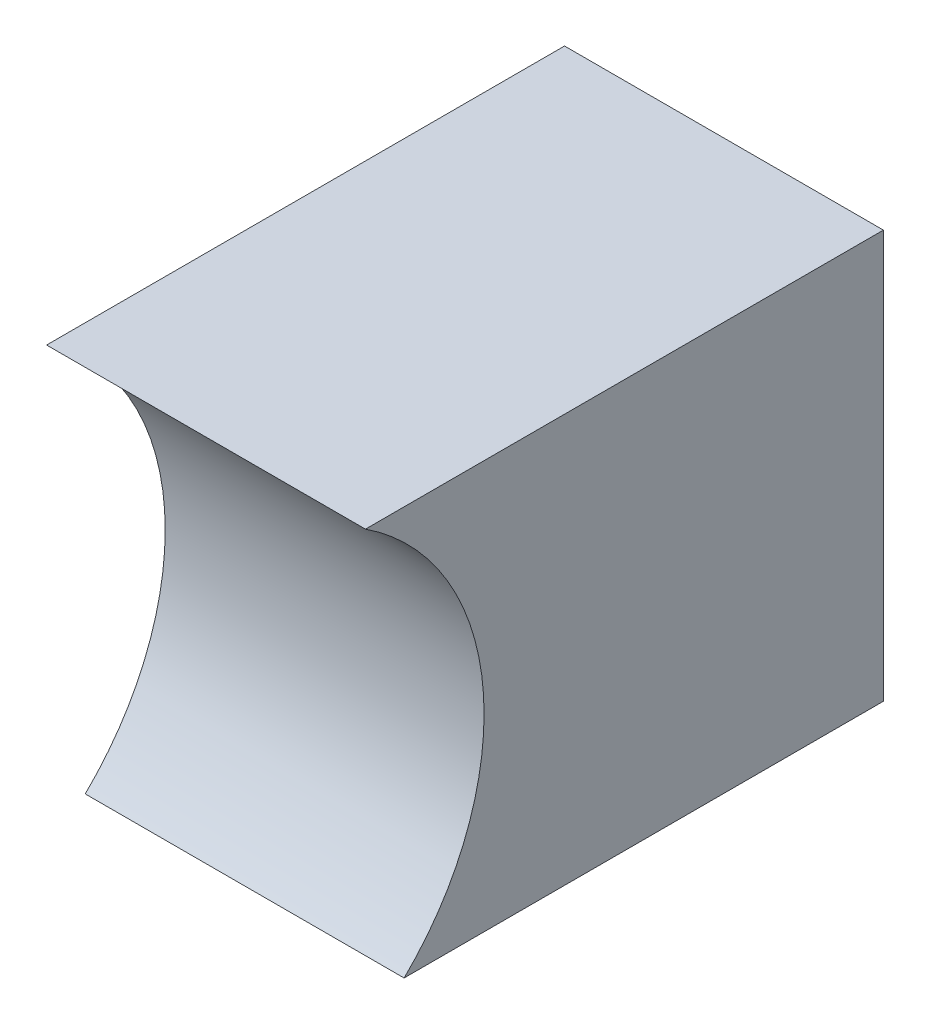
ISO-10303-21;
HEADER;
FILE_DESCRIPTION(('STEP AP214'),'2;1');
FILE_NAME('part.step','',(''),(''),'','','');
FILE_SCHEMA(('AUTOMOTIVE_DESIGN { 1 0 10303 214 1 1 1 1 }'));
ENDSEC;
DATA;
#1=APPLICATION_CONTEXT('core data for automotive mechanical design processes');
#2=APPLICATION_PROTOCOL_DEFINITION('international standard','automotive_design',2000,#1);
#3=PRODUCT_CONTEXT('',#1,'mechanical');
#4=PRODUCT('Part','Part','',(#3));
#5=PRODUCT_RELATED_PRODUCT_CATEGORY('part','',(#4));
#6=PRODUCT_DEFINITION_FORMATION('','',#4);
#7=PRODUCT_DEFINITION_CONTEXT('part definition',#1,'design');
#8=PRODUCT_DEFINITION('design','',#6,#7);
#9=PRODUCT_DEFINITION_SHAPE('','',#8);
#10=(LENGTH_UNIT() NAMED_UNIT(*) SI_UNIT(.MILLI.,.METRE.));
#11=(NAMED_UNIT(*) PLANE_ANGLE_UNIT() SI_UNIT($,.RADIAN.));
#12=(NAMED_UNIT(*) SI_UNIT($,.STERADIAN.) SOLID_ANGLE_UNIT());
#13=UNCERTAINTY_MEASURE_WITH_UNIT(LENGTH_MEASURE(1.E-05),#10,'distance_accuracy_value','');
#14=(GEOMETRIC_REPRESENTATION_CONTEXT(3) GLOBAL_UNCERTAINTY_ASSIGNED_CONTEXT((#13)) GLOBAL_UNIT_ASSIGNED_CONTEXT((#10,
#11,#12)) REPRESENTATION_CONTEXT('',''));
#15=CARTESIAN_POINT('',(0.,0.,0.));
#16=DIRECTION('',(0.,0.,1.));
#17=DIRECTION('',(1.,0.,0.));
#18=AXIS2_PLACEMENT_3D('',#15,#16,#17);
#19=CARTESIAN_POINT('',(208.5,-54.,101.5));
#20=DIRECTION('',(1.,0.,0.));
#21=DIRECTION('',(0.,0.,-1.));
#22=AXIS2_PLACEMENT_3D('',#19,#20,#21);
#23=PLANE('',#22);
#24=CARTESIAN_POINT('',(208.5,23.7500000000009,-59.5650000000027));
#25=DIRECTION('',(1.,0.,0.));
#26=DIRECTION('',(0.,-0.390407156329079,-0.920642304202366));
#27=AXIS2_PLACEMENT_3D('',#24,#25,#26);
#28=ELLIPSE('',#27,3.25000000226564,3.25);
#29=CARTESIAN_POINT('',(208.5,26.46876691231,-61.3456758483813));
#30=VERTEX_POINT('',#29);
#31=CARTESIAN_POINT('',(208.499991049822,21.4137224039434,-61.8242510535954));
#32=VERTEX_POINT('',#31);
#33=EDGE_CURVE('E61',#30,#32,#28,.F.);
#34=ORIENTED_EDGE('',*,*,#33,.T.);
#35=DIRECTION('',(0.,0.,-1.));
#36=VECTOR('',#35,1.);
#37=CARTESIAN_POINT('',(208.5,21.41373513185,-64.79305947409));
#38=LINE('',#37,#36);
#39=CARTESIAN_POINT('',(208.5,21.413735132295,-67.76183441315));
#40=VERTEX_POINT('',#39);
#41=EDGE_CURVE('E57',#32,#40,#38,.T.);
#42=ORIENTED_EDGE('',*,*,#41,.T.);
#43=DIRECTION('',(0.,-1.,0.));
#44=VECTOR('',#43,1.);
#45=CARTESIAN_POINT('',(208.5,23.94125107829,-67.76183441315));
#46=LINE('',#45,#44);
#47=CARTESIAN_POINT('',(208.5,26.46876691231,-67.76183441315));
#48=VERTEX_POINT('',#47);
#49=EDGE_CURVE('E59',#48,#40,#46,.T.);
#50=ORIENTED_EDGE('',*,*,#49,.F.);
#51=DIRECTION('',(0.,0.,-1.));
#52=VECTOR('',#51,1.);
#53=CARTESIAN_POINT('',(208.5,26.46876691062,101.5));
#54=LINE('',#53,#52);
#55=EDGE_CURVE('E52',#48,#30,#54,.F.);
#56=ORIENTED_EDGE('',*,*,#55,.T.);
#57=EDGE_LOOP('',(#34,#42,#50,#56));
#58=FACE_BOUND('',#57,.T.);
#59=ADVANCED_FACE('F17',(#58),#23,.T.);
#60=CARTESIAN_POINT('',(206.525,21.41373513185,-64.79305947409));
#61=DIRECTION('',(0.,1.,0.));
#62=DIRECTION('',(0.,0.,1.));
#63=AXIS2_PLACEMENT_3D('',#60,#61,#62);
#64=PLANE('',#63);
#65=DIRECTION('',(0.,0.,1.));
#66=VECTOR('',#65,1.);
#67=CARTESIAN_POINT('',(204.55,21.41373513185,-64.79305947409));
#68=LINE('',#67,#66);
#69=CARTESIAN_POINT('',(204.549996953622,21.4137509290986,-61.8241249045847));
#70=VERTEX_POINT('',#69);
#71=CARTESIAN_POINT('',(204.55,21.413735132295,-67.76183441315));
#72=VERTEX_POINT('',#71);
#73=EDGE_CURVE('E76',#70,#72,#68,.F.);
#74=ORIENTED_EDGE('',*,*,#73,.T.);
#75=DIRECTION('',(-1.,0.,0.));
#76=VECTOR('',#75,1.);
#77=CARTESIAN_POINT('',(206.525,21.41373513274,-67.76183441315));
#78=LINE('',#77,#76);
#79=EDGE_CURVE('E66',#40,#72,#78,.T.);
#80=ORIENTED_EDGE('',*,*,#79,.F.);
#81=ORIENTED_EDGE('',*,*,#41,.F.);
#82=CARTESIAN_POINT('',(208.499991048167,21.41373513185,-61.8242845053995));
#83=CARTESIAN_POINT('',(207.841658699371,21.41373513185,-61.8242519502028));
#84=CARTESIAN_POINT('',(207.183326350575,21.41373513185,-61.8242193950062));
#85=CARTESIAN_POINT('',(205.866661652982,21.41373513185,-61.8241542846129));
#86=CARTESIAN_POINT('',(205.208329304186,21.41373513185,-61.8241217294163));
#87=CARTESIAN_POINT('',(204.549996955389,21.41373513185,-61.8240891742197));
#88=B_SPLINE_CURVE_WITH_KNOTS('',3,(#82,#83,#84,#85,#86,#87),.UNSPECIFIED.,.F.,.F.,(4,2,4),(0.,
1.97499704880392,3.94999409760785),.UNSPECIFIED.);
#89=EDGE_CURVE('E88',#32,#70,#88,.T.);
#90=ORIENTED_EDGE('',*,*,#89,.T.);
#91=EDGE_LOOP('',(#74,#80,#81,#90));
#92=FACE_BOUND('',#91,.T.);
#93=ADVANCED_FACE('F74',(#92),#64,.F.);
#94=CARTESIAN_POINT('',(206.525,23.94125107829,-67.76183441315));
#95=DIRECTION('',(0.,0.,-1.));
#96=DIRECTION('',(-1.,0.,0.));
#97=AXIS2_PLACEMENT_3D('',#94,#95,#96);
#98=PLANE('',#97);
#99=DIRECTION('',(1.,0.,0.));
#100=VECTOR('',#99,1.);
#101=CARTESIAN_POINT('',(206.525,26.468766914,-67.76183441315));
#102=LINE('',#101,#100);
#103=CARTESIAN_POINT('',(204.55,26.468766914,-67.76183441315));
#104=VERTEX_POINT('',#103);
#105=EDGE_CURVE('E71',#104,#48,#102,.T.);
#106=ORIENTED_EDGE('',*,*,#105,.T.);
#107=ORIENTED_EDGE('',*,*,#49,.T.);
#108=ORIENTED_EDGE('',*,*,#79,.T.);
#109=DIRECTION('',(0.,1.,0.));
#110=VECTOR('',#109,1.);
#111=CARTESIAN_POINT('',(204.55,23.94125107829,-67.76183441315));
#112=LINE('',#111,#110);
#113=EDGE_CURVE('E83',#72,#104,#112,.T.);
#114=ORIENTED_EDGE('',*,*,#113,.T.);
#115=EDGE_LOOP('',(#106,#107,#108,#114));
#116=FACE_BOUND('',#115,.T.);
#117=ADVANCED_FACE('F68',(#116),#98,.T.);
#118=CARTESIAN_POINT('',(206.525,26.468766914,-64.55375519059));
#119=DIRECTION('',(0.,-1.,0.));
#120=DIRECTION('',(0.,0.,-1.));
#121=AXIS2_PLACEMENT_3D('',#118,#119,#120);
#122=PLANE('',#121);
#123=DIRECTION('',(0.,0.,-1.));
#124=VECTOR('',#123,1.);
#125=CARTESIAN_POINT('',(204.55,26.468766914,-64.55375519059));
#126=LINE('',#125,#124);
#127=CARTESIAN_POINT('',(204.550019258094,26.4688001775601,-61.3455202413637));
#128=VERTEX_POINT('',#127);
#129=EDGE_CURVE('E26',#104,#128,#126,.F.);
#130=ORIENTED_EDGE('',*,*,#129,.T.);
#131=CARTESIAN_POINT('',(204.550019256789,26.468766914,-61.3456279729839));
#132=CARTESIAN_POINT('',(205.208355706582,26.468766914,-61.3456359518634));
#133=CARTESIAN_POINT('',(205.866692156376,26.468766914,-61.3456439307429));
#134=CARTESIAN_POINT('',(207.183365055964,26.468766914,-61.345659888502));
#135=CARTESIAN_POINT('',(207.841701505757,26.468766914,-61.3456678673815));
#136=CARTESIAN_POINT('',(208.500037955551,26.468766914,-61.345675846261));
#137=B_SPLINE_CURVE_WITH_KNOTS('',3,(#131,#132,#133,#134,#135,#136),.UNSPECIFIED.,.F.,.F.,(4,2,
4),(0.,1.97500934952633,3.95001869905263),.UNSPECIFIED.);
#138=EDGE_CURVE('E34',#128,#30,#137,.T.);
#139=ORIENTED_EDGE('',*,*,#138,.T.);
#140=ORIENTED_EDGE('',*,*,#55,.F.);
#141=ORIENTED_EDGE('',*,*,#105,.F.);
#142=EDGE_LOOP('',(#130,#139,#140,#141));
#143=FACE_BOUND('',#142,.T.);
#144=ADVANCED_FACE('F108',(#143),#122,.F.);
#145=CARTESIAN_POINT('',(206.525,23.75002879077,-59.56493210678));
#146=DIRECTION('',(0.999999999302881,-1.45776046056997E-05,-3.43763152810394E-05));
#147=DIRECTION('',(-3.4376315284692E-05,0.,-0.999999999409135));
#148=AXIS2_PLACEMENT_3D('',#145,#146,#147);
#149=CYLINDRICAL_SURFACE('',#148,3.25);
#150=ORIENTED_EDGE('',*,*,#33,.F.);
#151=ORIENTED_EDGE('',*,*,#138,.F.);
#152=CARTESIAN_POINT('',(204.55,23.7500575815391,-59.5648642135573));
#153=DIRECTION('',(1.,0.,0.));
#154=DIRECTION('',(0.,-0.390407156329079,-0.920642304202366));
#155=AXIS2_PLACEMENT_3D('',#152,#153,#154);
#156=ELLIPSE('',#155,3.25000000226564,3.25);
#157=EDGE_CURVE('E11',#128,#70,#156,.F.);
#158=ORIENTED_EDGE('',*,*,#157,.T.);
#159=ORIENTED_EDGE('',*,*,#89,.F.);
#160=EDGE_LOOP('',(#150,#151,#158,#159));
#161=FACE_BOUND('',#160,.T.);
#162=ADVANCED_FACE('F102',(#161),#149,.F.);
#163=CARTESIAN_POINT('',(204.55,-54.,101.5));
#164=DIRECTION('',(1.,0.,0.));
#165=DIRECTION('',(0.,0.,-1.));
#166=AXIS2_PLACEMENT_3D('',#163,#164,#165);
#167=PLANE('',#166);
#168=ORIENTED_EDGE('',*,*,#129,.F.);
#169=ORIENTED_EDGE('',*,*,#113,.F.);
#170=ORIENTED_EDGE('',*,*,#73,.F.);
#171=ORIENTED_EDGE('',*,*,#157,.F.);
#172=EDGE_LOOP('',(#168,#169,#170,#171));
#173=FACE_BOUND('',#172,.T.);
#174=ADVANCED_FACE('F107',(#173),#167,.F.);
#175=CLOSED_SHELL('',(#59,#93,#117,#144,#162,#174));
#176=MANIFOLD_SOLID_BREP('B1',#175);
#177=ADVANCED_BREP_SHAPE_REPRESENTATION('',(#18,#176),#14);
#178=SHAPE_DEFINITION_REPRESENTATION(#9,#177);
ENDSEC;
END-ISO-10303-21;
